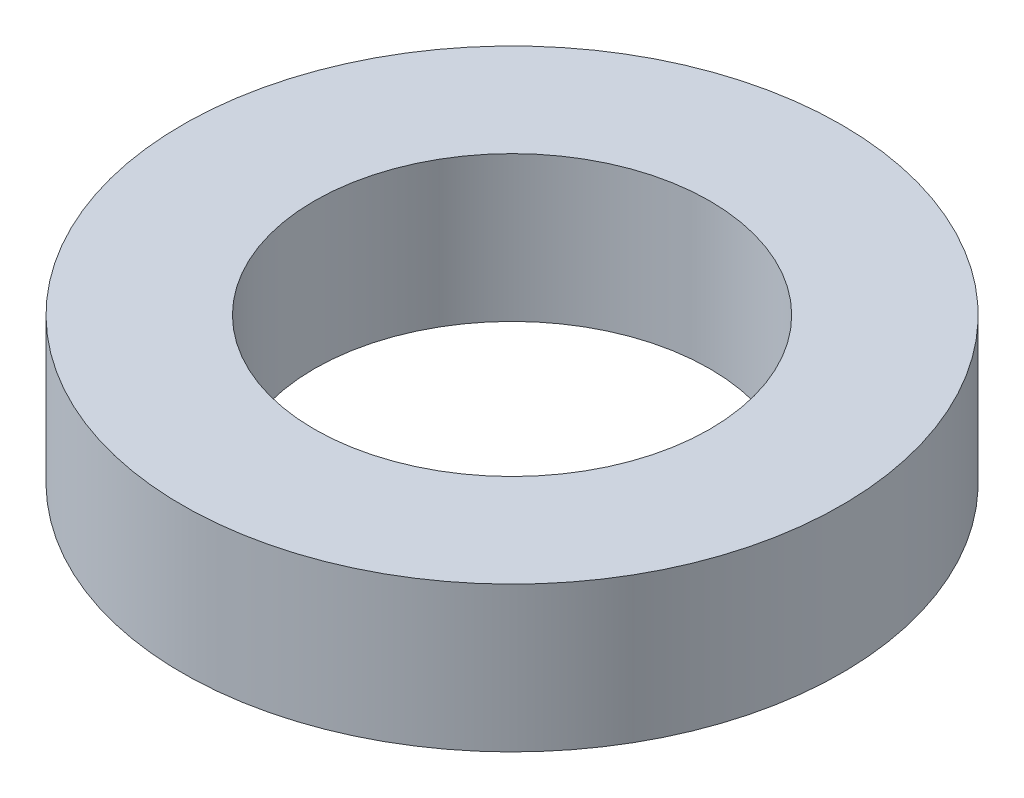
ISO-10303-21;
HEADER;
FILE_DESCRIPTION(('STEP AP214'),'2;1');
FILE_NAME('part.step','',(''),(''),'','','');
FILE_SCHEMA(('AUTOMOTIVE_DESIGN { 1 0 10303 214 1 1 1 1 }'));
ENDSEC;
DATA;
#1=APPLICATION_CONTEXT('core data for automotive mechanical design processes');
#2=APPLICATION_PROTOCOL_DEFINITION('international standard','automotive_design',2000,#1);
#3=PRODUCT_CONTEXT('',#1,'mechanical');
#4=PRODUCT('Part','Part','',(#3));
#5=PRODUCT_RELATED_PRODUCT_CATEGORY('part','',(#4));
#6=PRODUCT_DEFINITION_FORMATION('','',#4);
#7=PRODUCT_DEFINITION_CONTEXT('part definition',#1,'design');
#8=PRODUCT_DEFINITION('design','',#6,#7);
#9=PRODUCT_DEFINITION_SHAPE('','',#8);
#10=(LENGTH_UNIT() NAMED_UNIT(*) SI_UNIT(.MILLI.,.METRE.));
#11=(NAMED_UNIT(*) PLANE_ANGLE_UNIT() SI_UNIT($,.RADIAN.));
#12=(NAMED_UNIT(*) SI_UNIT($,.STERADIAN.) SOLID_ANGLE_UNIT());
#13=UNCERTAINTY_MEASURE_WITH_UNIT(LENGTH_MEASURE(1.E-05),#10,'distance_accuracy_value','');
#14=(GEOMETRIC_REPRESENTATION_CONTEXT(3) GLOBAL_UNCERTAINTY_ASSIGNED_CONTEXT((#13)) GLOBAL_UNIT_ASSIGNED_CONTEXT((#10,
#11,#12)) REPRESENTATION_CONTEXT('',''));
#15=CARTESIAN_POINT('',(0.,0.,0.));
#16=DIRECTION('',(0.,0.,1.));
#17=DIRECTION('',(1.,0.,0.));
#18=AXIS2_PLACEMENT_3D('',#15,#16,#17);
#19=CARTESIAN_POINT('',(0.,3.5,0.));
#20=DIRECTION('',(0.,1.,0.));
#21=DIRECTION('',(0.,0.,1.));
#22=AXIS2_PLACEMENT_3D('',#19,#20,#21);
#23=PLANE('',#22);
#24=CARTESIAN_POINT('',(0.,3.5,0.));
#25=DIRECTION('',(0.,1.,0.));
#26=DIRECTION('',(0.,0.,1.));
#27=AXIS2_PLACEMENT_3D('',#24,#25,#26);
#28=CIRCLE('',#27,7.9375);
#29=CARTESIAN_POINT('',(0.,3.5,-7.9375));
#30=VERTEX_POINT('',#29);
#31=EDGE_CURVE('E10',#30,#30,#28,.T.);
#32=ORIENTED_EDGE('',*,*,#31,.T.);
#33=EDGE_LOOP('',(#32));
#34=FACE_BOUND('',#33,.T.);
#35=CARTESIAN_POINT('',(0.,3.5,0.));
#36=DIRECTION('',(0.,1.,0.));
#37=DIRECTION('',(0.,0.,1.));
#38=AXIS2_PLACEMENT_3D('',#35,#36,#37);
#39=CIRCLE('',#38,4.7625);
#40=CARTESIAN_POINT('',(0.,3.5,-4.7625));
#41=VERTEX_POINT('',#40);
#42=EDGE_CURVE('E42',#41,#41,#39,.T.);
#43=ORIENTED_EDGE('',*,*,#42,.F.);
#44=EDGE_LOOP('',(#43));
#45=FACE_BOUND('',#44,.T.);
#46=ADVANCED_FACE('F31',(#34,#45),#23,.T.);
#47=CARTESIAN_POINT('',(0.,0.,0.));
#48=DIRECTION('',(0.,1.,0.));
#49=DIRECTION('',(0.,0.,1.));
#50=AXIS2_PLACEMENT_3D('',#47,#48,#49);
#51=PLANE('',#50);
#52=CARTESIAN_POINT('',(0.,0.,0.));
#53=DIRECTION('',(0.,1.,0.));
#54=DIRECTION('',(0.,0.,1.));
#55=AXIS2_PLACEMENT_3D('',#52,#53,#54);
#56=CIRCLE('',#55,7.9375);
#57=CARTESIAN_POINT('',(0.,0.,-7.9375));
#58=VERTEX_POINT('',#57);
#59=EDGE_CURVE('E35',#58,#58,#56,.T.);
#60=ORIENTED_EDGE('',*,*,#59,.F.);
#61=EDGE_LOOP('',(#60));
#62=FACE_BOUND('',#61,.T.);
#63=CARTESIAN_POINT('',(0.,0.,0.));
#64=DIRECTION('',(0.,1.,0.));
#65=DIRECTION('',(0.,0.,1.));
#66=AXIS2_PLACEMENT_3D('',#63,#64,#65);
#67=CIRCLE('',#66,4.7625);
#68=CARTESIAN_POINT('',(0.,0.,-4.7625));
#69=VERTEX_POINT('',#68);
#70=EDGE_CURVE('E44',#69,#69,#67,.T.);
#71=ORIENTED_EDGE('',*,*,#70,.T.);
#72=EDGE_LOOP('',(#71));
#73=FACE_BOUND('',#72,.T.);
#74=ADVANCED_FACE('F54',(#62,#73),#51,.F.);
#75=CARTESIAN_POINT('',(0.,3.5,0.));
#76=DIRECTION('',(0.,-1.,0.));
#77=DIRECTION('',(0.,0.,-1.));
#78=AXIS2_PLACEMENT_3D('',#75,#76,#77);
#79=CYLINDRICAL_SURFACE('',#78,7.9375);
#80=CARTESIAN_POINT('',(0.,3.5,-7.9375));
#81=CARTESIAN_POINT('',(0.,3.46354166666667,-7.9375));
#82=CARTESIAN_POINT('',(0.,3.42708333333333,-7.9375));
#83=CARTESIAN_POINT('',(0.,3.35416666666667,-7.9375));
#84=CARTESIAN_POINT('',(0.,3.31770833333333,-7.9375));
#85=CARTESIAN_POINT('',(0.,3.24479166666667,-7.9375));
#86=CARTESIAN_POINT('',(0.,3.20833333333333,-7.9375));
#87=CARTESIAN_POINT('',(0.,3.13541666666667,-7.9375));
#88=CARTESIAN_POINT('',(0.,3.09895833333333,-7.9375));
#89=CARTESIAN_POINT('',(0.,3.02604166666667,-7.9375));
#90=CARTESIAN_POINT('',(0.,2.98958333333333,-7.9375));
#91=CARTESIAN_POINT('',(0.,2.91666666666667,-7.9375));
#92=CARTESIAN_POINT('',(0.,2.88020833333333,-7.9375));
#93=CARTESIAN_POINT('',(0.,2.80729166666667,-7.9375));
#94=CARTESIAN_POINT('',(0.,2.77083333333333,-7.9375));
#95=CARTESIAN_POINT('',(0.,2.69791666666667,-7.9375));
#96=CARTESIAN_POINT('',(0.,2.66145833333333,-7.9375));
#97=CARTESIAN_POINT('',(0.,2.58854166666667,-7.9375));
#98=CARTESIAN_POINT('',(0.,2.55208333333333,-7.9375));
#99=CARTESIAN_POINT('',(0.,2.47916666666667,-7.9375));
#100=CARTESIAN_POINT('',(0.,2.44270833333333,-7.9375));
#101=CARTESIAN_POINT('',(0.,2.36979166666667,-7.9375));
#102=CARTESIAN_POINT('',(0.,2.33333333333333,-7.9375));
#103=CARTESIAN_POINT('',(0.,2.26041666666667,-7.9375));
#104=CARTESIAN_POINT('',(0.,2.22395833333333,-7.9375));
#105=CARTESIAN_POINT('',(0.,2.15104166666667,-7.9375));
#106=CARTESIAN_POINT('',(0.,2.11458333333333,-7.9375));
#107=CARTESIAN_POINT('',(0.,2.04166666666667,-7.9375));
#108=CARTESIAN_POINT('',(0.,2.00520833333333,-7.9375));
#109=CARTESIAN_POINT('',(0.,1.93229166666667,-7.9375));
#110=CARTESIAN_POINT('',(0.,1.89583333333333,-7.9375));
#111=CARTESIAN_POINT('',(0.,1.82291666666667,-7.9375));
#112=CARTESIAN_POINT('',(0.,1.78645833333333,-7.9375));
#113=CARTESIAN_POINT('',(0.,1.71354166666667,-7.9375));
#114=CARTESIAN_POINT('',(0.,1.67708333333333,-7.9375));
#115=CARTESIAN_POINT('',(0.,1.60416666666667,-7.9375));
#116=CARTESIAN_POINT('',(0.,1.56770833333333,-7.9375));
#117=CARTESIAN_POINT('',(0.,1.49479166666667,-7.9375));
#118=CARTESIAN_POINT('',(0.,1.45833333333333,-7.9375));
#119=CARTESIAN_POINT('',(0.,1.38541666666667,-7.9375));
#120=CARTESIAN_POINT('',(0.,1.34895833333333,-7.9375));
#121=CARTESIAN_POINT('',(0.,1.27604166666667,-7.9375));
#122=CARTESIAN_POINT('',(0.,1.23958333333333,-7.9375));
#123=CARTESIAN_POINT('',(0.,1.16666666666667,-7.9375));
#124=CARTESIAN_POINT('',(0.,1.13020833333333,-7.9375));
#125=CARTESIAN_POINT('',(0.,1.05729166666667,-7.9375));
#126=CARTESIAN_POINT('',(0.,1.02083333333333,-7.9375));
#127=CARTESIAN_POINT('',(0.,0.947916666666666,-7.9375));
#128=CARTESIAN_POINT('',(0.,0.911458333333333,-7.9375));
#129=CARTESIAN_POINT('',(0.,0.838541666666666,-7.9375));
#130=CARTESIAN_POINT('',(0.,0.802083333333333,-7.9375));
#131=CARTESIAN_POINT('',(0.,0.729166666666666,-7.9375));
#132=CARTESIAN_POINT('',(0.,0.692708333333333,-7.9375));
#133=CARTESIAN_POINT('',(0.,0.619791666666666,-7.9375));
#134=CARTESIAN_POINT('',(0.,0.583333333333333,-7.9375));
#135=CARTESIAN_POINT('',(0.,0.510416666666666,-7.9375));
#136=CARTESIAN_POINT('',(0.,0.473958333333333,-7.9375));
#137=CARTESIAN_POINT('',(0.,0.401041666666666,-7.9375));
#138=CARTESIAN_POINT('',(0.,0.364583333333333,-7.9375));
#139=CARTESIAN_POINT('',(0.,0.291666666666666,-7.9375));
#140=CARTESIAN_POINT('',(0.,0.255208333333333,-7.9375));
#141=CARTESIAN_POINT('',(0.,0.182291666666666,-7.9375));
#142=CARTESIAN_POINT('',(0.,0.145833333333333,-7.9375));
#143=CARTESIAN_POINT('',(0.,0.0729166666666663,-7.9375));
#144=CARTESIAN_POINT('',(0.,0.0364583333333329,-7.9375));
#145=CARTESIAN_POINT('',(0.,0.,-7.9375));
#146=B_SPLINE_CURVE_WITH_KNOTS('',3,(#80,#81,#82,#83,#84,#85,#86,#87,#88,#89,#90,#91,#92,#93,
#94,#95,#96,#97,#98,#99,#100,#101,#102,#103,#104,#105,#106,#107,#108,#109,#110,#111,#112,#113,
#114,#115,#116,#117,#118,#119,#120,#121,#122,#123,#124,#125,#126,#127,#128,#129,#130,#131,#132,
#133,#134,#135,#136,#137,#138,#139,#140,#141,#142,#143,#144,#145),.UNSPECIFIED.,.F.,.F.,(4,2,2,
2,2,2,2,2,2,2,2,2,2,2,2,2,2,2,2,2,2,2,2,2,2,2,2,2,2,2,2,2,4),(0.,0.109375,0.21875,0.328125,
0.4375,0.546875,0.65625,0.765625,0.874999999999999,0.984375,1.09375,1.203125,1.3125,1.421875,
1.53125,1.640625,1.75,1.859375,1.96875,2.078125,2.1875,2.296875,2.40625,2.515625,2.625,2.734375,
2.84375,2.953125,3.0625,3.171875,3.28125,3.390625,3.5),.UNSPECIFIED.);
#147=EDGE_CURVE('BSEAM33',#30,#58,#146,.T.);
#148=ORIENTED_EDGE('',*,*,#31,.F.);
#149=ORIENTED_EDGE('',*,*,#59,.T.);
#150=ORIENTED_EDGE('',*,*,#147,.T.);
#151=ORIENTED_EDGE('',*,*,#147,.F.);
#152=EDGE_LOOP('',(#148,#150,#149,#151));
#153=FACE_BOUND('',#152,.T.);
#154=ADVANCED_FACE('F33',(#153),#79,.T.);
#155=CARTESIAN_POINT('',(0.,3.5,0.));
#156=DIRECTION('',(0.,-1.,0.));
#157=DIRECTION('',(0.,0.,-1.));
#158=AXIS2_PLACEMENT_3D('',#155,#156,#157);
#159=CYLINDRICAL_SURFACE('',#158,4.7625);
#160=CARTESIAN_POINT('',(0.,3.5,-4.7625));
#161=CARTESIAN_POINT('',(0.,3.46354166666667,-4.7625));
#162=CARTESIAN_POINT('',(0.,3.42708333333333,-4.7625));
#163=CARTESIAN_POINT('',(0.,3.35416666666667,-4.7625));
#164=CARTESIAN_POINT('',(0.,3.31770833333333,-4.7625));
#165=CARTESIAN_POINT('',(0.,3.24479166666667,-4.7625));
#166=CARTESIAN_POINT('',(0.,3.20833333333333,-4.7625));
#167=CARTESIAN_POINT('',(0.,3.13541666666667,-4.7625));
#168=CARTESIAN_POINT('',(0.,3.09895833333333,-4.7625));
#169=CARTESIAN_POINT('',(0.,3.02604166666667,-4.7625));
#170=CARTESIAN_POINT('',(0.,2.98958333333333,-4.7625));
#171=CARTESIAN_POINT('',(0.,2.91666666666667,-4.7625));
#172=CARTESIAN_POINT('',(0.,2.88020833333333,-4.7625));
#173=CARTESIAN_POINT('',(0.,2.80729166666667,-4.7625));
#174=CARTESIAN_POINT('',(0.,2.77083333333333,-4.7625));
#175=CARTESIAN_POINT('',(0.,2.69791666666667,-4.7625));
#176=CARTESIAN_POINT('',(0.,2.66145833333333,-4.7625));
#177=CARTESIAN_POINT('',(0.,2.58854166666667,-4.7625));
#178=CARTESIAN_POINT('',(0.,2.55208333333333,-4.7625));
#179=CARTESIAN_POINT('',(0.,2.47916666666667,-4.7625));
#180=CARTESIAN_POINT('',(0.,2.44270833333333,-4.7625));
#181=CARTESIAN_POINT('',(0.,2.36979166666667,-4.7625));
#182=CARTESIAN_POINT('',(0.,2.33333333333333,-4.7625));
#183=CARTESIAN_POINT('',(0.,2.26041666666667,-4.7625));
#184=CARTESIAN_POINT('',(0.,2.22395833333333,-4.7625));
#185=CARTESIAN_POINT('',(0.,2.15104166666667,-4.7625));
#186=CARTESIAN_POINT('',(0.,2.11458333333333,-4.7625));
#187=CARTESIAN_POINT('',(0.,2.04166666666667,-4.7625));
#188=CARTESIAN_POINT('',(0.,2.00520833333333,-4.7625));
#189=CARTESIAN_POINT('',(0.,1.93229166666667,-4.7625));
#190=CARTESIAN_POINT('',(0.,1.89583333333333,-4.7625));
#191=CARTESIAN_POINT('',(0.,1.82291666666667,-4.7625));
#192=CARTESIAN_POINT('',(0.,1.78645833333333,-4.7625));
#193=CARTESIAN_POINT('',(0.,1.71354166666667,-4.7625));
#194=CARTESIAN_POINT('',(0.,1.67708333333333,-4.7625));
#195=CARTESIAN_POINT('',(0.,1.60416666666667,-4.7625));
#196=CARTESIAN_POINT('',(0.,1.56770833333333,-4.7625));
#197=CARTESIAN_POINT('',(0.,1.49479166666667,-4.7625));
#198=CARTESIAN_POINT('',(0.,1.45833333333333,-4.7625));
#199=CARTESIAN_POINT('',(0.,1.38541666666667,-4.7625));
#200=CARTESIAN_POINT('',(0.,1.34895833333333,-4.7625));
#201=CARTESIAN_POINT('',(0.,1.27604166666667,-4.7625));
#202=CARTESIAN_POINT('',(0.,1.23958333333333,-4.7625));
#203=CARTESIAN_POINT('',(0.,1.16666666666667,-4.7625));
#204=CARTESIAN_POINT('',(0.,1.13020833333333,-4.7625));
#205=CARTESIAN_POINT('',(0.,1.05729166666667,-4.7625));
#206=CARTESIAN_POINT('',(0.,1.02083333333333,-4.7625));
#207=CARTESIAN_POINT('',(0.,0.947916666666666,-4.7625));
#208=CARTESIAN_POINT('',(0.,0.911458333333333,-4.7625));
#209=CARTESIAN_POINT('',(0.,0.838541666666666,-4.7625));
#210=CARTESIAN_POINT('',(0.,0.802083333333333,-4.7625));
#211=CARTESIAN_POINT('',(0.,0.729166666666667,-4.7625));
#212=CARTESIAN_POINT('',(0.,0.692708333333333,-4.7625));
#213=CARTESIAN_POINT('',(0.,0.619791666666666,-4.7625));
#214=CARTESIAN_POINT('',(0.,0.583333333333333,-4.7625));
#215=CARTESIAN_POINT('',(0.,0.510416666666666,-4.7625));
#216=CARTESIAN_POINT('',(0.,0.473958333333333,-4.7625));
#217=CARTESIAN_POINT('',(0.,0.401041666666666,-4.7625));
#218=CARTESIAN_POINT('',(0.,0.364583333333333,-4.7625));
#219=CARTESIAN_POINT('',(0.,0.291666666666666,-4.7625));
#220=CARTESIAN_POINT('',(0.,0.255208333333333,-4.7625));
#221=CARTESIAN_POINT('',(0.,0.182291666666666,-4.7625));
#222=CARTESIAN_POINT('',(0.,0.145833333333333,-4.7625));
#223=CARTESIAN_POINT('',(0.,0.0729166666666663,-4.7625));
#224=CARTESIAN_POINT('',(0.,0.0364583333333329,-4.7625));
#225=CARTESIAN_POINT('',(0.,0.,-4.7625));
#226=B_SPLINE_CURVE_WITH_KNOTS('',3,(#160,#161,#162,#163,#164,#165,#166,#167,#168,#169,#170,
#171,#172,#173,#174,#175,#176,#177,#178,#179,#180,#181,#182,#183,#184,#185,#186,#187,#188,#189,
#190,#191,#192,#193,#194,#195,#196,#197,#198,#199,#200,#201,#202,#203,#204,#205,#206,#207,#208,
#209,#210,#211,#212,#213,#214,#215,#216,#217,#218,#219,#220,#221,#222,#223,#224,#225),
.UNSPECIFIED.,.F.,.F.,(4,2,2,2,2,2,2,2,2,2,2,2,2,2,2,2,2,2,2,2,2,2,2,2,2,2,2,2,2,2,2,2,4),(0.,
0.109375,0.21875,0.328125,0.4375,0.546875,0.65625,0.765625,0.875,0.984375,1.09375,1.203125,
1.3125,1.421875,1.53125,1.640625,1.75,1.859375,1.96875,2.078125,2.1875,2.296875,2.40625,
2.515625,2.625,2.734375,2.84375,2.953125,3.0625,3.171875,3.28125,3.390625,3.5),.UNSPECIFIED.);
#227=EDGE_CURVE('BSEAM50',#41,#69,#226,.T.);
#228=ORIENTED_EDGE('',*,*,#42,.T.);
#229=ORIENTED_EDGE('',*,*,#70,.F.);
#230=ORIENTED_EDGE('',*,*,#227,.T.);
#231=ORIENTED_EDGE('',*,*,#227,.F.);
#232=EDGE_LOOP('',(#228,#230,#229,#231));
#233=FACE_BOUND('',#232,.T.);
#234=ADVANCED_FACE('F50',(#233),#159,.F.);
#235=CLOSED_SHELL('',(#46,#74,#154,#234));
#236=MANIFOLD_SOLID_BREP('B2',#235);
#237=ADVANCED_BREP_SHAPE_REPRESENTATION('',(#18,#236),#14);
#238=SHAPE_DEFINITION_REPRESENTATION(#9,#237);
ENDSEC;
END-ISO-10303-21;
